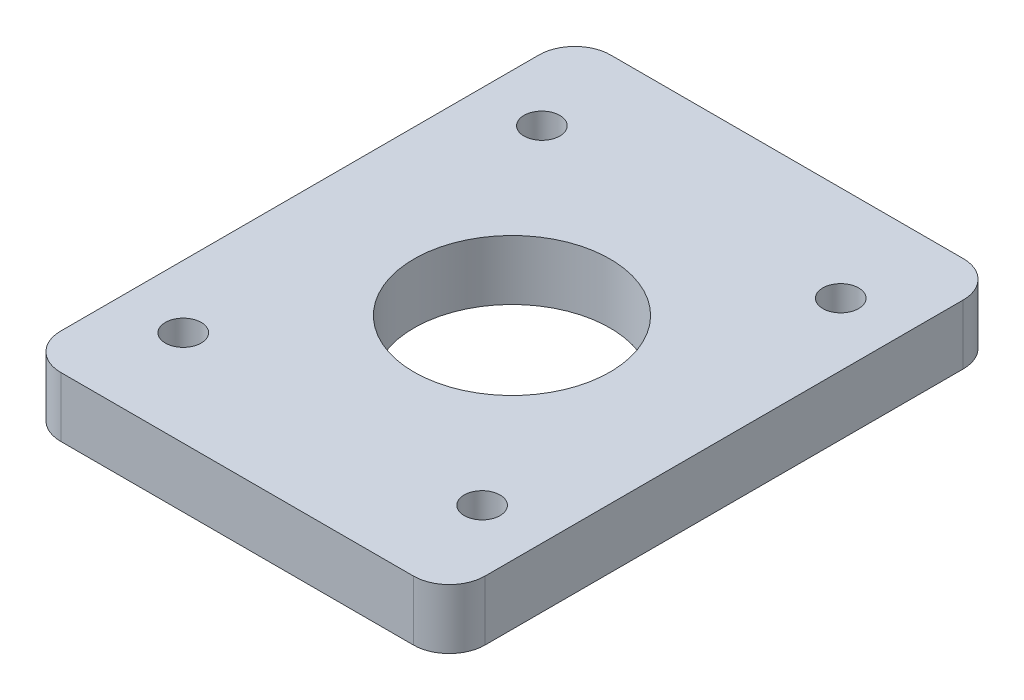
ISO-10303-21;
HEADER;
FILE_DESCRIPTION(('STEP AP214'),'2;1');
FILE_NAME('part.step','',(''),(''),'','','');
FILE_SCHEMA(('AUTOMOTIVE_DESIGN { 1 0 10303 214 1 1 1 1 }'));
ENDSEC;
DATA;
#1=APPLICATION_CONTEXT('core data for automotive mechanical design processes');
#2=APPLICATION_PROTOCOL_DEFINITION('international standard','automotive_design',2000,#1);
#3=PRODUCT_CONTEXT('',#1,'mechanical');
#4=PRODUCT('Part','Part','',(#3));
#5=PRODUCT_RELATED_PRODUCT_CATEGORY('part','',(#4));
#6=PRODUCT_DEFINITION_FORMATION('','',#4);
#7=PRODUCT_DEFINITION_CONTEXT('part definition',#1,'design');
#8=PRODUCT_DEFINITION('design','',#6,#7);
#9=PRODUCT_DEFINITION_SHAPE('','',#8);
#10=(LENGTH_UNIT() NAMED_UNIT(*) SI_UNIT(.MILLI.,.METRE.));
#11=(NAMED_UNIT(*) PLANE_ANGLE_UNIT() SI_UNIT($,.RADIAN.));
#12=(NAMED_UNIT(*) SI_UNIT($,.STERADIAN.) SOLID_ANGLE_UNIT());
#13=UNCERTAINTY_MEASURE_WITH_UNIT(LENGTH_MEASURE(1.E-05),#10,'distance_accuracy_value','');
#14=(GEOMETRIC_REPRESENTATION_CONTEXT(3) GLOBAL_UNCERTAINTY_ASSIGNED_CONTEXT((#13)) GLOBAL_UNIT_ASSIGNED_CONTEXT((#10,
#11,#12)) REPRESENTATION_CONTEXT('',''));
#15=CARTESIAN_POINT('',(0.,0.,0.));
#16=DIRECTION('',(0.,0.,1.));
#17=DIRECTION('',(1.,0.,0.));
#18=AXIS2_PLACEMENT_3D('',#15,#16,#17);
#19=CARTESIAN_POINT('',(0.,5.,0.));
#20=DIRECTION('',(0.,-1.,0.));
#21=DIRECTION('',(0.,0.,-1.));
#22=AXIS2_PLACEMENT_3D('',#19,#20,#21);
#23=PLANE('',#22);
#24=CARTESIAN_POINT('',(-12.5,5.,-22.25));
#25=DIRECTION('',(0.,-1.,0.));
#26=DIRECTION('',(0.,0.,-1.));
#27=AXIS2_PLACEMENT_3D('',#24,#25,#26);
#28=CIRCLE('',#27,1.5);
#29=CARTESIAN_POINT('',(-12.5,5.,-23.75));
#30=VERTEX_POINT('',#29);
#31=EDGE_CURVE('E186',#30,#30,#28,.T.);
#32=ORIENTED_EDGE('',*,*,#31,.T.);
#33=EDGE_LOOP('',(#32));
#34=FACE_BOUND('',#33,.T.);
#35=CARTESIAN_POINT('',(12.5,5.,-22.25));
#36=DIRECTION('',(0.,-1.,0.));
#37=DIRECTION('',(0.,0.,-1.));
#38=AXIS2_PLACEMENT_3D('',#35,#36,#37);
#39=CIRCLE('',#38,1.5);
#40=CARTESIAN_POINT('',(12.5,5.,-23.75));
#41=VERTEX_POINT('',#40);
#42=EDGE_CURVE('E190',#41,#41,#39,.T.);
#43=ORIENTED_EDGE('',*,*,#42,.T.);
#44=EDGE_LOOP('',(#43));
#45=FACE_BOUND('',#44,.T.);
#46=CARTESIAN_POINT('',(12.5,5.,7.75000000000001));
#47=DIRECTION('',(0.,-1.,0.));
#48=DIRECTION('',(0.,0.,-1.));
#49=AXIS2_PLACEMENT_3D('',#46,#47,#48);
#50=CIRCLE('',#49,1.5);
#51=CARTESIAN_POINT('',(12.5,5.,6.25000000000001));
#52=VERTEX_POINT('',#51);
#53=EDGE_CURVE('E193',#52,#52,#50,.T.);
#54=ORIENTED_EDGE('',*,*,#53,.T.);
#55=EDGE_LOOP('',(#54));
#56=FACE_BOUND('',#55,.T.);
#57=CARTESIAN_POINT('',(-12.5,5.,7.75000000000001));
#58=DIRECTION('',(0.,-1.,0.));
#59=DIRECTION('',(0.,0.,-1.));
#60=AXIS2_PLACEMENT_3D('',#57,#58,#59);
#61=CIRCLE('',#60,1.5);
#62=CARTESIAN_POINT('',(-12.5,5.,6.25000000000001));
#63=VERTEX_POINT('',#62);
#64=EDGE_CURVE('E196',#63,#63,#61,.T.);
#65=ORIENTED_EDGE('',*,*,#64,.T.);
#66=EDGE_LOOP('',(#65));
#67=FACE_BOUND('',#66,.T.);
#68=DIRECTION('',(1.,0.,0.));
#69=VECTOR('',#68,1.);
#70=CARTESIAN_POINT('',(-17.75,5.,15.75));
#71=LINE('',#70,#69);
#72=CARTESIAN_POINT('',(-14.75,5.,15.75));
#73=VERTEX_POINT('',#72);
#74=CARTESIAN_POINT('',(14.75,5.,15.75));
#75=VERTEX_POINT('',#74);
#76=EDGE_CURVE('E172',#73,#75,#71,.T.);
#77=ORIENTED_EDGE('',*,*,#76,.T.);
#78=CARTESIAN_POINT('',(14.75,5.,12.75));
#79=DIRECTION('',(0.,-1.,0.));
#80=DIRECTION('',(0.,0.,-1.));
#81=AXIS2_PLACEMENT_3D('',#78,#79,#80);
#82=CIRCLE('',#81,3.);
#83=CARTESIAN_POINT('',(17.75,5.,12.75));
#84=VERTEX_POINT('',#83);
#85=EDGE_CURVE('E150',#75,#84,#82,.F.);
#86=ORIENTED_EDGE('',*,*,#85,.T.);
#87=DIRECTION('',(0.,0.,-1.));
#88=VECTOR('',#87,1.);
#89=CARTESIAN_POINT('',(17.75,5.,15.75));
#90=LINE('',#89,#88);
#91=CARTESIAN_POINT('',(17.75,5.,-27.25));
#92=VERTEX_POINT('',#91);
#93=EDGE_CURVE('E120',#84,#92,#90,.T.);
#94=ORIENTED_EDGE('',*,*,#93,.T.);
#95=CARTESIAN_POINT('',(14.75,5.,-27.25));
#96=DIRECTION('',(0.,-1.,0.));
#97=DIRECTION('',(0.,0.,-1.));
#98=AXIS2_PLACEMENT_3D('',#95,#96,#97);
#99=CIRCLE('',#98,3.);
#100=CARTESIAN_POINT('',(14.75,5.,-30.25));
#101=VERTEX_POINT('',#100);
#102=EDGE_CURVE('E56',#92,#101,#99,.F.);
#103=ORIENTED_EDGE('',*,*,#102,.T.);
#104=DIRECTION('',(-1.,0.,0.));
#105=VECTOR('',#104,1.);
#106=CARTESIAN_POINT('',(-17.75,5.,-30.25));
#107=LINE('',#106,#105);
#108=CARTESIAN_POINT('',(-14.75,5.,-30.25));
#109=VERTEX_POINT('',#108);
#110=EDGE_CURVE('E136',#101,#109,#107,.T.);
#111=ORIENTED_EDGE('',*,*,#110,.T.);
#112=CARTESIAN_POINT('',(-14.75,5.,-27.25));
#113=DIRECTION('',(0.,-1.,0.));
#114=DIRECTION('',(0.,0.,-1.));
#115=AXIS2_PLACEMENT_3D('',#112,#113,#114);
#116=CIRCLE('',#115,3.);
#117=CARTESIAN_POINT('',(-17.75,5.,-27.25));
#118=VERTEX_POINT('',#117);
#119=EDGE_CURVE('E146',#109,#118,#116,.F.);
#120=ORIENTED_EDGE('',*,*,#119,.T.);
#121=DIRECTION('',(0.,0.,1.));
#122=VECTOR('',#121,1.);
#123=CARTESIAN_POINT('',(-17.75,5.,15.75));
#124=LINE('',#123,#122);
#125=CARTESIAN_POINT('',(-17.75,5.,12.75));
#126=VERTEX_POINT('',#125);
#127=EDGE_CURVE('E130',#118,#126,#124,.T.);
#128=ORIENTED_EDGE('',*,*,#127,.T.);
#129=CARTESIAN_POINT('',(-14.75,5.,12.75));
#130=DIRECTION('',(0.,-1.,0.));
#131=DIRECTION('',(0.,0.,-1.));
#132=AXIS2_PLACEMENT_3D('',#129,#130,#131);
#133=CIRCLE('',#132,3.);
#134=EDGE_CURVE('E148',#126,#73,#133,.F.);
#135=ORIENTED_EDGE('',*,*,#134,.T.);
#136=EDGE_LOOP('',(#77,#86,#94,#103,#111,#120,#128,#135));
#137=FACE_BOUND('',#136,.T.);
#138=CARTESIAN_POINT('',(0.,5.,-7.24999999999999));
#139=DIRECTION('',(0.,1.,0.));
#140=DIRECTION('',(0.,0.,1.));
#141=AXIS2_PLACEMENT_3D('',#138,#139,#140);
#142=CIRCLE('',#141,8.2);
#143=CARTESIAN_POINT('',(0.,5.,0.950000000000005));
#144=VERTEX_POINT('',#143);
#145=EDGE_CURVE('E181',#144,#144,#142,.T.);
#146=ORIENTED_EDGE('',*,*,#145,.F.);
#147=EDGE_LOOP('',(#146));
#148=FACE_BOUND('',#147,.T.);
#149=ADVANCED_FACE('F36',(#34,#45,#56,#67,#137,#148),#23,.F.);
#150=CARTESIAN_POINT('',(0.,0.,0.));
#151=DIRECTION('',(0.,-1.,0.));
#152=DIRECTION('',(0.,0.,-1.));
#153=AXIS2_PLACEMENT_3D('',#150,#151,#152);
#154=PLANE('',#153);
#155=CARTESIAN_POINT('',(-12.5,0.,-22.25));
#156=DIRECTION('',(0.,-1.,0.));
#157=DIRECTION('',(0.,0.,1.));
#158=AXIS2_PLACEMENT_3D('',#155,#156,#157);
#159=CIRCLE('',#158,1.5);
#160=CARTESIAN_POINT('',(-12.5,0.,-20.75));
#161=VERTEX_POINT('',#160);
#162=EDGE_CURVE('E203',#161,#161,#159,.T.);
#163=ORIENTED_EDGE('',*,*,#162,.F.);
#164=EDGE_LOOP('',(#163));
#165=FACE_BOUND('',#164,.T.);
#166=CARTESIAN_POINT('',(12.5,0.,-22.25));
#167=DIRECTION('',(0.,-1.,0.));
#168=DIRECTION('',(0.,0.,-1.));
#169=AXIS2_PLACEMENT_3D('',#166,#167,#168);
#170=CIRCLE('',#169,1.5);
#171=CARTESIAN_POINT('',(12.5,0.,-23.75));
#172=VERTEX_POINT('',#171);
#173=EDGE_CURVE('E206',#172,#172,#170,.T.);
#174=ORIENTED_EDGE('',*,*,#173,.F.);
#175=EDGE_LOOP('',(#174));
#176=FACE_BOUND('',#175,.T.);
#177=CARTESIAN_POINT('',(12.5,0.,7.75000000000001));
#178=DIRECTION('',(0.,-1.,0.));
#179=DIRECTION('',(0.,0.,1.));
#180=AXIS2_PLACEMENT_3D('',#177,#178,#179);
#181=CIRCLE('',#180,1.5);
#182=CARTESIAN_POINT('',(12.5,0.,9.25000000000001));
#183=VERTEX_POINT('',#182);
#184=EDGE_CURVE('E202',#183,#183,#181,.T.);
#185=ORIENTED_EDGE('',*,*,#184,.F.);
#186=EDGE_LOOP('',(#185));
#187=FACE_BOUND('',#186,.T.);
#188=CARTESIAN_POINT('',(-12.5,0.,7.75000000000001));
#189=DIRECTION('',(0.,-1.,0.));
#190=DIRECTION('',(0.,0.,-1.));
#191=AXIS2_PLACEMENT_3D('',#188,#189,#190);
#192=CIRCLE('',#191,1.5);
#193=CARTESIAN_POINT('',(-12.5,0.,6.25000000000001));
#194=VERTEX_POINT('',#193);
#195=EDGE_CURVE('E199',#194,#194,#192,.T.);
#196=ORIENTED_EDGE('',*,*,#195,.F.);
#197=EDGE_LOOP('',(#196));
#198=FACE_BOUND('',#197,.T.);
#199=DIRECTION('',(0.,0.,-1.));
#200=VECTOR('',#199,1.);
#201=CARTESIAN_POINT('',(17.75,0.,15.75));
#202=LINE('',#201,#200);
#203=CARTESIAN_POINT('',(17.75,0.,12.75));
#204=VERTEX_POINT('',#203);
#205=CARTESIAN_POINT('',(17.75,0.,-27.25));
#206=VERTEX_POINT('',#205);
#207=EDGE_CURVE('E118',#204,#206,#202,.T.);
#208=ORIENTED_EDGE('',*,*,#207,.F.);
#209=CARTESIAN_POINT('',(14.75,0.,12.75));
#210=DIRECTION('',(0.,-1.,0.));
#211=DIRECTION('',(0.,0.,-1.));
#212=AXIS2_PLACEMENT_3D('',#209,#210,#211);
#213=CIRCLE('',#212,3.);
#214=CARTESIAN_POINT('',(14.75,0.,15.75));
#215=VERTEX_POINT('',#214);
#216=EDGE_CURVE('E101',#204,#215,#213,.T.);
#217=ORIENTED_EDGE('',*,*,#216,.T.);
#218=DIRECTION('',(1.,0.,0.));
#219=VECTOR('',#218,1.);
#220=CARTESIAN_POINT('',(-17.75,0.,15.75));
#221=LINE('',#220,#219);
#222=CARTESIAN_POINT('',(-14.75,0.,15.75));
#223=VERTEX_POINT('',#222);
#224=EDGE_CURVE('E128',#223,#215,#221,.T.);
#225=ORIENTED_EDGE('',*,*,#224,.F.);
#226=CARTESIAN_POINT('',(-14.75,0.,12.75));
#227=DIRECTION('',(0.,-1.,0.));
#228=DIRECTION('',(0.,0.,-1.));
#229=AXIS2_PLACEMENT_3D('',#226,#227,#228);
#230=CIRCLE('',#229,3.);
#231=CARTESIAN_POINT('',(-17.75,0.,12.75));
#232=VERTEX_POINT('',#231);
#233=EDGE_CURVE('E112',#223,#232,#230,.T.);
#234=ORIENTED_EDGE('',*,*,#233,.T.);
#235=DIRECTION('',(0.,0.,1.));
#236=VECTOR('',#235,1.);
#237=CARTESIAN_POINT('',(-17.75,0.,15.75));
#238=LINE('',#237,#236);
#239=CARTESIAN_POINT('',(-17.75,0.,-27.25));
#240=VERTEX_POINT('',#239);
#241=EDGE_CURVE('E132',#240,#232,#238,.T.);
#242=ORIENTED_EDGE('',*,*,#241,.F.);
#243=CARTESIAN_POINT('',(-14.75,0.,-27.25));
#244=DIRECTION('',(0.,-1.,0.));
#245=DIRECTION('',(0.,0.,-1.));
#246=AXIS2_PLACEMENT_3D('',#243,#244,#245);
#247=CIRCLE('',#246,3.);
#248=CARTESIAN_POINT('',(-14.75,0.,-30.25));
#249=VERTEX_POINT('',#248);
#250=EDGE_CURVE('E139',#240,#249,#247,.T.);
#251=ORIENTED_EDGE('',*,*,#250,.T.);
#252=DIRECTION('',(-1.,0.,0.));
#253=VECTOR('',#252,1.);
#254=CARTESIAN_POINT('',(-17.75,0.,-30.25));
#255=LINE('',#254,#253);
#256=CARTESIAN_POINT('',(14.75,0.,-30.25));
#257=VERTEX_POINT('',#256);
#258=EDGE_CURVE('E127',#257,#249,#255,.T.);
#259=ORIENTED_EDGE('',*,*,#258,.F.);
#260=CARTESIAN_POINT('',(14.75,0.,-27.25));
#261=DIRECTION('',(0.,-1.,0.));
#262=DIRECTION('',(0.,0.,-1.));
#263=AXIS2_PLACEMENT_3D('',#260,#261,#262);
#264=CIRCLE('',#263,3.);
#265=EDGE_CURVE('E121',#257,#206,#264,.T.);
#266=ORIENTED_EDGE('',*,*,#265,.T.);
#267=EDGE_LOOP('',(#208,#217,#225,#234,#242,#251,#259,#266));
#268=FACE_BOUND('',#267,.T.);
#269=CARTESIAN_POINT('',(0.,0.,-7.24999999999999));
#270=DIRECTION('',(0.,1.,0.));
#271=DIRECTION('',(0.,0.,1.));
#272=AXIS2_PLACEMENT_3D('',#269,#270,#271);
#273=CIRCLE('',#272,8.2);
#274=CARTESIAN_POINT('',(0.,0.,0.950000000000005));
#275=VERTEX_POINT('',#274);
#276=EDGE_CURVE('E177',#275,#275,#273,.T.);
#277=ORIENTED_EDGE('',*,*,#276,.T.);
#278=EDGE_LOOP('',(#277));
#279=FACE_BOUND('',#278,.T.);
#280=ADVANCED_FACE('F124',(#165,#176,#187,#198,#268,#279),#154,.T.);
#281=CARTESIAN_POINT('',(-17.75,5.,15.75));
#282=DIRECTION('',(1.,0.,0.));
#283=DIRECTION('',(0.,0.,-1.));
#284=AXIS2_PLACEMENT_3D('',#281,#282,#283);
#285=PLANE('',#284);
#286=ORIENTED_EDGE('',*,*,#241,.T.);
#287=DIRECTION('',(0.,-1.,0.));
#288=VECTOR('',#287,1.);
#289=CARTESIAN_POINT('',(-17.75,5.,12.75));
#290=LINE('',#289,#288);
#291=EDGE_CURVE('E155',#232,#126,#290,.F.);
#292=ORIENTED_EDGE('',*,*,#291,.T.);
#293=ORIENTED_EDGE('',*,*,#127,.F.);
#294=DIRECTION('',(0.,-1.,0.));
#295=VECTOR('',#294,1.);
#296=CARTESIAN_POINT('',(-17.75,5.,-27.25));
#297=LINE('',#296,#295);
#298=EDGE_CURVE('E152',#118,#240,#297,.T.);
#299=ORIENTED_EDGE('',*,*,#298,.T.);
#300=EDGE_LOOP('',(#286,#292,#293,#299));
#301=FACE_BOUND('',#300,.T.);
#302=ADVANCED_FACE('F168',(#301),#285,.F.);
#303=CARTESIAN_POINT('',(-17.75,5.,15.75));
#304=DIRECTION('',(0.,0.,-1.));
#305=DIRECTION('',(-1.,0.,0.));
#306=AXIS2_PLACEMENT_3D('',#303,#304,#305);
#307=PLANE('',#306);
#308=ORIENTED_EDGE('',*,*,#224,.T.);
#309=DIRECTION('',(0.,-1.,0.));
#310=VECTOR('',#309,1.);
#311=CARTESIAN_POINT('',(14.75,5.,15.75));
#312=LINE('',#311,#310);
#313=EDGE_CURVE('E106',#215,#75,#312,.F.);
#314=ORIENTED_EDGE('',*,*,#313,.T.);
#315=ORIENTED_EDGE('',*,*,#76,.F.);
#316=DIRECTION('',(0.,-1.,0.));
#317=VECTOR('',#316,1.);
#318=CARTESIAN_POINT('',(-14.75,5.,15.75));
#319=LINE('',#318,#317);
#320=EDGE_CURVE('E111',#73,#223,#319,.T.);
#321=ORIENTED_EDGE('',*,*,#320,.T.);
#322=EDGE_LOOP('',(#308,#314,#315,#321));
#323=FACE_BOUND('',#322,.T.);
#324=ADVANCED_FACE('F234',(#323),#307,.F.);
#325=CARTESIAN_POINT('',(17.75,5.,15.75));
#326=DIRECTION('',(-1.,0.,0.));
#327=DIRECTION('',(0.,0.,1.));
#328=AXIS2_PLACEMENT_3D('',#325,#326,#327);
#329=PLANE('',#328);
#330=ORIENTED_EDGE('',*,*,#93,.F.);
#331=DIRECTION('',(0.,-1.,0.));
#332=VECTOR('',#331,1.);
#333=CARTESIAN_POINT('',(17.75,5.,12.75));
#334=LINE('',#333,#332);
#335=EDGE_CURVE('E105',#84,#204,#334,.T.);
#336=ORIENTED_EDGE('',*,*,#335,.T.);
#337=ORIENTED_EDGE('',*,*,#207,.T.);
#338=DIRECTION('',(0.,-1.,0.));
#339=VECTOR('',#338,1.);
#340=CARTESIAN_POINT('',(17.75,5.,-27.25));
#341=LINE('',#340,#339);
#342=EDGE_CURVE('E122',#206,#92,#341,.F.);
#343=ORIENTED_EDGE('',*,*,#342,.T.);
#344=EDGE_LOOP('',(#330,#336,#337,#343));
#345=FACE_BOUND('',#344,.T.);
#346=ADVANCED_FACE('F117',(#345),#329,.F.);
#347=CARTESIAN_POINT('',(-17.75,5.,-30.25));
#348=DIRECTION('',(0.,0.,1.));
#349=DIRECTION('',(1.,0.,0.));
#350=AXIS2_PLACEMENT_3D('',#347,#348,#349);
#351=PLANE('',#350);
#352=ORIENTED_EDGE('',*,*,#258,.T.);
#353=DIRECTION('',(0.,-1.,0.));
#354=VECTOR('',#353,1.);
#355=CARTESIAN_POINT('',(-14.75,5.,-30.25));
#356=LINE('',#355,#354);
#357=EDGE_CURVE('E11',#249,#109,#356,.F.);
#358=ORIENTED_EDGE('',*,*,#357,.T.);
#359=ORIENTED_EDGE('',*,*,#110,.F.);
#360=DIRECTION('',(0.,-1.,0.));
#361=VECTOR('',#360,1.);
#362=CARTESIAN_POINT('',(14.75,5.,-30.25));
#363=LINE('',#362,#361);
#364=EDGE_CURVE('E44',#101,#257,#363,.T.);
#365=ORIENTED_EDGE('',*,*,#364,.T.);
#366=EDGE_LOOP('',(#352,#358,#359,#365));
#367=FACE_BOUND('',#366,.T.);
#368=ADVANCED_FACE('F158',(#367),#351,.F.);
#369=CARTESIAN_POINT('',(0.,5.,-7.24999999999999));
#370=DIRECTION('',(0.,-1.,0.));
#371=DIRECTION('',(0.,0.,-1.));
#372=AXIS2_PLACEMENT_3D('',#369,#370,#371);
#373=CYLINDRICAL_SURFACE('',#372,8.2);
#374=ORIENTED_EDGE('',*,*,#145,.T.);
#375=EDGE_LOOP('',(#374));
#376=FACE_BOUND('',#375,.T.);
#377=ORIENTED_EDGE('',*,*,#276,.F.);
#378=EDGE_LOOP('',(#377));
#379=FACE_BOUND('',#378,.T.);
#380=ADVANCED_FACE('F243',(#376,#379),#373,.F.);
#381=CARTESIAN_POINT('',(14.75,5.,12.75));
#382=DIRECTION('',(0.,-1.,0.));
#383=DIRECTION('',(0.,0.,-1.));
#384=AXIS2_PLACEMENT_3D('',#381,#382,#383);
#385=CYLINDRICAL_SURFACE('',#384,3.);
#386=ORIENTED_EDGE('',*,*,#85,.F.);
#387=ORIENTED_EDGE('',*,*,#313,.F.);
#388=ORIENTED_EDGE('',*,*,#216,.F.);
#389=ORIENTED_EDGE('',*,*,#335,.F.);
#390=EDGE_LOOP('',(#386,#387,#388,#389));
#391=FACE_BOUND('',#390,.T.);
#392=ADVANCED_FACE('F104',(#391),#385,.T.);
#393=CARTESIAN_POINT('',(-14.75,5.,12.75));
#394=DIRECTION('',(0.,-1.,0.));
#395=DIRECTION('',(0.,0.,-1.));
#396=AXIS2_PLACEMENT_3D('',#393,#394,#395);
#397=CYLINDRICAL_SURFACE('',#396,3.);
#398=ORIENTED_EDGE('',*,*,#134,.F.);
#399=ORIENTED_EDGE('',*,*,#291,.F.);
#400=ORIENTED_EDGE('',*,*,#233,.F.);
#401=ORIENTED_EDGE('',*,*,#320,.F.);
#402=EDGE_LOOP('',(#398,#399,#400,#401));
#403=FACE_BOUND('',#402,.T.);
#404=ADVANCED_FACE('F236',(#403),#397,.T.);
#405=CARTESIAN_POINT('',(-14.75,5.,-27.25));
#406=DIRECTION('',(0.,-1.,0.));
#407=DIRECTION('',(0.,0.,-1.));
#408=AXIS2_PLACEMENT_3D('',#405,#406,#407);
#409=CYLINDRICAL_SURFACE('',#408,3.);
#410=ORIENTED_EDGE('',*,*,#119,.F.);
#411=ORIENTED_EDGE('',*,*,#357,.F.);
#412=ORIENTED_EDGE('',*,*,#250,.F.);
#413=ORIENTED_EDGE('',*,*,#298,.F.);
#414=EDGE_LOOP('',(#410,#411,#412,#413));
#415=FACE_BOUND('',#414,.T.);
#416=ADVANCED_FACE('F165',(#415),#409,.T.);
#417=CARTESIAN_POINT('',(14.75,5.,-27.25));
#418=DIRECTION('',(0.,-1.,0.));
#419=DIRECTION('',(0.,0.,-1.));
#420=AXIS2_PLACEMENT_3D('',#417,#418,#419);
#421=CYLINDRICAL_SURFACE('',#420,3.);
#422=ORIENTED_EDGE('',*,*,#102,.F.);
#423=ORIENTED_EDGE('',*,*,#342,.F.);
#424=ORIENTED_EDGE('',*,*,#265,.F.);
#425=ORIENTED_EDGE('',*,*,#364,.F.);
#426=EDGE_LOOP('',(#422,#423,#424,#425));
#427=FACE_BOUND('',#426,.T.);
#428=ADVANCED_FACE('F38',(#427),#421,.T.);
#429=CARTESIAN_POINT('',(-12.5,10.,7.75000000000001));
#430=DIRECTION('',(0.,-1.,0.));
#431=DIRECTION('',(0.,0.,-1.));
#432=AXIS2_PLACEMENT_3D('',#429,#430,#431);
#433=CYLINDRICAL_SURFACE('',#432,1.5);
#434=ORIENTED_EDGE('',*,*,#195,.T.);
#435=EDGE_LOOP('',(#434));
#436=FACE_BOUND('',#435,.T.);
#437=ORIENTED_EDGE('',*,*,#64,.F.);
#438=EDGE_LOOP('',(#437));
#439=FACE_BOUND('',#438,.T.);
#440=ADVANCED_FACE('F221',(#436,#439),#433,.F.);
#441=CARTESIAN_POINT('',(12.5,10.,7.75000000000001));
#442=DIRECTION('',(0.,-1.,0.));
#443=DIRECTION('',(0.,0.,-1.));
#444=AXIS2_PLACEMENT_3D('',#441,#442,#443);
#445=CYLINDRICAL_SURFACE('',#444,1.5);
#446=ORIENTED_EDGE('',*,*,#184,.T.);
#447=EDGE_LOOP('',(#446));
#448=FACE_BOUND('',#447,.T.);
#449=ORIENTED_EDGE('',*,*,#53,.F.);
#450=EDGE_LOOP('',(#449));
#451=FACE_BOUND('',#450,.T.);
#452=ADVANCED_FACE('F212',(#448,#451),#445,.F.);
#453=CARTESIAN_POINT('',(12.5,10.,-22.25));
#454=DIRECTION('',(0.,-1.,0.));
#455=DIRECTION('',(0.,0.,-1.));
#456=AXIS2_PLACEMENT_3D('',#453,#454,#455);
#457=CYLINDRICAL_SURFACE('',#456,1.5);
#458=ORIENTED_EDGE('',*,*,#173,.T.);
#459=EDGE_LOOP('',(#458));
#460=FACE_BOUND('',#459,.T.);
#461=ORIENTED_EDGE('',*,*,#42,.F.);
#462=EDGE_LOOP('',(#461));
#463=FACE_BOUND('',#462,.T.);
#464=ADVANCED_FACE('F259',(#460,#463),#457,.F.);
#465=CARTESIAN_POINT('',(-12.5,10.,-22.25));
#466=DIRECTION('',(0.,-1.,0.));
#467=DIRECTION('',(0.,0.,-1.));
#468=AXIS2_PLACEMENT_3D('',#465,#466,#467);
#469=CYLINDRICAL_SURFACE('',#468,1.5);
#470=ORIENTED_EDGE('',*,*,#162,.T.);
#471=EDGE_LOOP('',(#470));
#472=FACE_BOUND('',#471,.T.);
#473=ORIENTED_EDGE('',*,*,#31,.F.);
#474=EDGE_LOOP('',(#473));
#475=FACE_BOUND('',#474,.T.);
#476=ADVANCED_FACE('F256',(#472,#475),#469,.F.);
#477=CLOSED_SHELL('',(#149,#280,#302,#324,#346,#368,#380,#392,#404,#416,#428,#440,#452,#464,#476));
#478=MANIFOLD_SOLID_BREP('B2',#477);
#479=ADVANCED_BREP_SHAPE_REPRESENTATION('',(#18,#478),#14);
#480=SHAPE_DEFINITION_REPRESENTATION(#9,#479);
ENDSEC;
END-ISO-10303-21;
